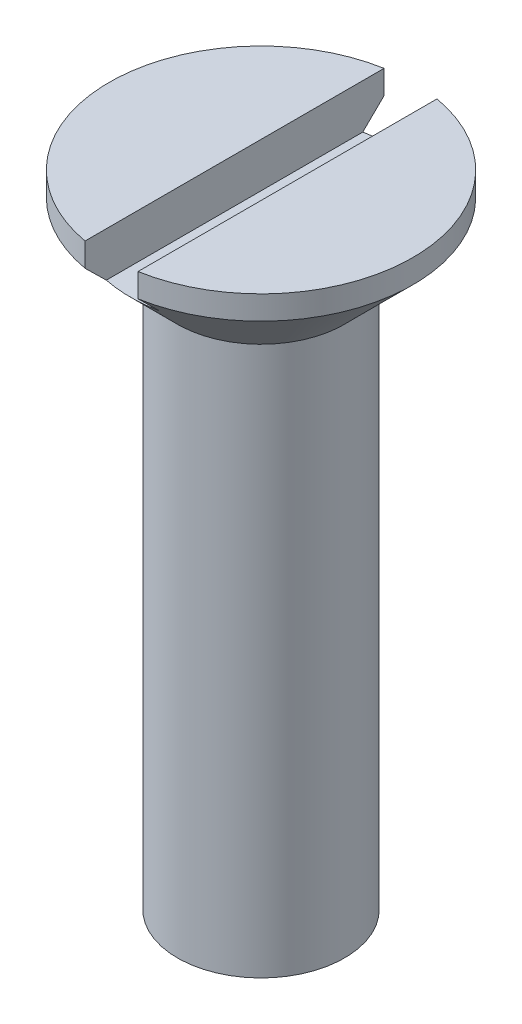
ISO-10303-21;
HEADER;
FILE_DESCRIPTION(('STEP AP214'),'2;1');
FILE_NAME('part.step','',(''),(''),'','','');
FILE_SCHEMA(('AUTOMOTIVE_DESIGN { 1 0 10303 214 1 1 1 1 }'));
ENDSEC;
DATA;
#1=APPLICATION_CONTEXT('core data for automotive mechanical design processes');
#2=APPLICATION_PROTOCOL_DEFINITION('international standard','automotive_design',2000,#1);
#3=PRODUCT_CONTEXT('',#1,'mechanical');
#4=PRODUCT('Part','Part','',(#3));
#5=PRODUCT_RELATED_PRODUCT_CATEGORY('part','',(#4));
#6=PRODUCT_DEFINITION_FORMATION('','',#4);
#7=PRODUCT_DEFINITION_CONTEXT('part definition',#1,'design');
#8=PRODUCT_DEFINITION('design','',#6,#7);
#9=PRODUCT_DEFINITION_SHAPE('','',#8);
#10=(LENGTH_UNIT() NAMED_UNIT(*) SI_UNIT(.MILLI.,.METRE.));
#11=(NAMED_UNIT(*) PLANE_ANGLE_UNIT() SI_UNIT($,.RADIAN.));
#12=(NAMED_UNIT(*) SI_UNIT($,.STERADIAN.) SOLID_ANGLE_UNIT());
#13=UNCERTAINTY_MEASURE_WITH_UNIT(LENGTH_MEASURE(1.E-05),#10,'distance_accuracy_value','');
#14=(GEOMETRIC_REPRESENTATION_CONTEXT(3) GLOBAL_UNCERTAINTY_ASSIGNED_CONTEXT((#13)) GLOBAL_UNIT_ASSIGNED_CONTEXT((#10,
#11,#12)) REPRESENTATION_CONTEXT('',''));
#15=CARTESIAN_POINT('',(0.,0.,0.));
#16=DIRECTION('',(0.,0.,1.));
#17=DIRECTION('',(1.,0.,0.));
#18=AXIS2_PLACEMENT_3D('',#15,#16,#17);
#19=CARTESIAN_POINT('',(0.,23.,0.));
#20=DIRECTION('',(0.,1.,0.));
#21=DIRECTION('',(-1.,0.,0.));
#22=AXIS2_PLACEMENT_3D('',#19,#20,#21);
#23=CYLINDRICAL_SURFACE('',#22,5.45);
#24=DIRECTION('',(0.,1.,0.));
#25=VECTOR('',#24,1.);
#26=CARTESIAN_POINT('',(-0.95,23.,5.36656314599949));
#27=LINE('',#26,#25);
#28=CARTESIAN_POINT('',(-0.95,23.,5.36656314599949));
#29=VERTEX_POINT('',#28);
#30=CARTESIAN_POINT('',(-0.95,22.15,5.36656314599949));
#31=VERTEX_POINT('',#30);
#32=EDGE_CURVE('E129',#29,#31,#27,.F.);
#33=ORIENTED_EDGE('',*,*,#32,.F.);
#34=CARTESIAN_POINT('',(0.,23.,0.));
#35=DIRECTION('',(0.,1.,0.));
#36=DIRECTION('',(-1.,0.,0.));
#37=AXIS2_PLACEMENT_3D('',#34,#35,#36);
#38=CIRCLE('',#37,5.45);
#39=CARTESIAN_POINT('',(-0.95,23.,-5.36656314599949));
#40=VERTEX_POINT('',#39);
#41=EDGE_CURVE('E120',#40,#29,#38,.T.);
#42=ORIENTED_EDGE('',*,*,#41,.F.);
#43=DIRECTION('',(0.,1.,0.));
#44=VECTOR('',#43,1.);
#45=CARTESIAN_POINT('',(-0.95,23.,-5.36656314599949));
#46=LINE('',#45,#44);
#47=CARTESIAN_POINT('',(-0.95,22.15,-5.36656314599949));
#48=VERTEX_POINT('',#47);
#49=EDGE_CURVE('E165',#48,#40,#46,.T.);
#50=ORIENTED_EDGE('',*,*,#49,.F.);
#51=CARTESIAN_POINT('',(0.,22.15,0.));
#52=DIRECTION('',(0.,1.,0.));
#53=DIRECTION('',(-1.,0.,0.));
#54=AXIS2_PLACEMENT_3D('',#51,#52,#53);
#55=CIRCLE('',#54,5.45);
#56=EDGE_CURVE('E119',#48,#31,#55,.T.);
#57=ORIENTED_EDGE('',*,*,#56,.T.);
#58=EDGE_LOOP('',(#33,#42,#50,#57));
#59=FACE_BOUND('',#58,.T.);
#60=ADVANCED_FACE('F45',(#59),#23,.T.);
#61=CARTESIAN_POINT('',(0.,23.,0.));
#62=DIRECTION('',(0.,1.,0.));
#63=DIRECTION('',(-1.,0.,0.));
#64=AXIS2_PLACEMENT_3D('',#61,#62,#63);
#65=PLANE('',#64);
#66=DIRECTION('',(0.,0.,1.));
#67=VECTOR('',#66,1.);
#68=CARTESIAN_POINT('',(-0.95,23.,0.));
#69=LINE('',#68,#67);
#70=EDGE_CURVE('E104',#40,#29,#69,.T.);
#71=ORIENTED_EDGE('',*,*,#70,.F.);
#72=ORIENTED_EDGE('',*,*,#41,.T.);
#73=EDGE_LOOP('',(#71,#72));
#74=FACE_BOUND('',#73,.T.);
#75=ADVANCED_FACE('F184',(#74),#65,.T.);
#76=CARTESIAN_POINT('',(0.,0.,0.));
#77=DIRECTION('',(0.,1.,0.));
#78=DIRECTION('',(-1.,0.,0.));
#79=AXIS2_PLACEMENT_3D('',#76,#77,#78);
#80=CONICAL_SURFACE('',#79,3.,1.04719755119659);
#81=CARTESIAN_POINT('',(0.,-1.7320508075689,0.));
#82=VERTEX_POINT('',#81);
#83=VERTEX_LOOP('',#82);
#84=FACE_BOUND('',#83,.T.);
#85=CARTESIAN_POINT('',(0.,0.,0.));
#86=DIRECTION('',(0.,1.,0.));
#87=DIRECTION('',(-1.,0.,0.));
#88=AXIS2_PLACEMENT_3D('',#85,#86,#87);
#89=CIRCLE('',#88,3.);
#90=CARTESIAN_POINT('',(-3.,0.,0.));
#91=VERTEX_POINT('',#90);
#92=EDGE_CURVE('E105',#91,#91,#89,.T.);
#93=ORIENTED_EDGE('',*,*,#92,.F.);
#94=EDGE_LOOP('',(#93));
#95=FACE_BOUND('',#94,.T.);
#96=ADVANCED_FACE('F47',(#84,#95),#80,.T.);
#97=CARTESIAN_POINT('',(0.,23.,0.));
#98=DIRECTION('',(0.,1.,0.));
#99=DIRECTION('',(-1.,0.,0.));
#100=AXIS2_PLACEMENT_3D('',#97,#98,#99);
#101=CYLINDRICAL_SURFACE('',#100,3.);
#102=ORIENTED_EDGE('',*,*,#92,.T.);
#103=EDGE_LOOP('',(#102));
#104=FACE_BOUND('',#103,.T.);
#105=CARTESIAN_POINT('',(0.,19.7,0.));
#106=DIRECTION('',(0.,1.,0.));
#107=DIRECTION('',(-1.,0.,0.));
#108=AXIS2_PLACEMENT_3D('',#105,#106,#107);
#109=CIRCLE('',#108,3.);
#110=CARTESIAN_POINT('',(-3.,19.7,0.));
#111=VERTEX_POINT('',#110);
#112=EDGE_CURVE('E132',#111,#111,#109,.T.);
#113=ORIENTED_EDGE('',*,*,#112,.F.);
#114=EDGE_LOOP('',(#113));
#115=FACE_BOUND('',#114,.T.);
#116=ADVANCED_FACE('F189',(#104,#115),#101,.T.);
#117=CARTESIAN_POINT('',(0.,22.15,0.));
#118=DIRECTION('',(0.,1.,0.));
#119=DIRECTION('',(-1.,0.,0.));
#120=AXIS2_PLACEMENT_3D('',#117,#118,#119);
#121=CONICAL_SURFACE('',#120,5.45,0.785398163397444);
#122=CARTESIAN_POINT('',(-0.95,22.1507,5.36727402784691));
#123=CARTESIAN_POINT('',(-0.95,22.0066414645828,5.22096942686692));
#124=CARTESIAN_POINT('',(-0.95,21.8626670090981,5.07458190529039));
#125=CARTESIAN_POINT('',(-0.95,21.5748101059668,4.78142879407387));
#126=CARTESIAN_POINT('',(-0.95,21.4309278942986,4.63466297275422));
#127=CARTESIAN_POINT('',(-0.95,21.1409084092543,4.33821736729775));
#128=CARTESIAN_POINT('',(-0.95,20.9947766015238,4.18853223049866));
#129=CARTESIAN_POINT('',(-0.95,20.703095971748,3.8888862480953));
#130=CARTESIAN_POINT('',(-0.95,20.5575467133769,3.73892582684178));
#131=CARTESIAN_POINT('',(-0.95,20.1841431553791,3.35268732026557));
#132=CARTESIAN_POINT('',(-0.95,19.9567216786612,3.11598875256886));
#133=CARTESIAN_POINT('',(-0.95,19.6172653560709,2.75849636400411));
#134=CARTESIAN_POINT('',(-0.950000000000001,19.5041829404961,2.63869876965934));
#135=CARTESIAN_POINT('',(-0.950000000000001,19.279122950606,2.3981635782147));
#136=CARTESIAN_POINT('',(-0.950000000000001,19.1671449310138,2.27742639827611));
#137=CARTESIAN_POINT('',(-0.950000000000001,18.9464813770811,2.03630430512404));
#138=CARTESIAN_POINT('',(-0.95,18.8377716601377,1.9159416674153));
#139=CARTESIAN_POINT('',(-0.950000000000001,18.6765899716622,1.73355249406455));
#140=CARTESIAN_POINT('',(-0.950000000000001,18.6231332919473,1.67239741852466));
#141=CARTESIAN_POINT('',(-0.950000000000001,18.5171142480341,1.54931822073711));
#142=CARTESIAN_POINT('',(-0.950000000000001,18.4645518520347,1.48739412597211));
#143=CARTESIAN_POINT('',(-0.950000000000001,18.3610106756752,1.36295298776711));
#144=CARTESIAN_POINT('',(-0.950000000000001,18.3100234789139,1.30044297031367));
#145=CARTESIAN_POINT('',(-0.950000000000001,18.2097768557509,1.17405781364908));
#146=CARTESIAN_POINT('',(-0.950000000000001,18.1605171425635,1.11018290388926));
#147=CARTESIAN_POINT('',(-0.950000000000001,18.0646842233115,0.980693167144416));
#148=CARTESIAN_POINT('',(-0.950000000000001,18.018104441057,0.915083231273146));
#149=CARTESIAN_POINT('',(-0.950000000000001,17.9289406266786,0.781218199399258));
#150=CARTESIAN_POINT('',(-0.950000000000001,17.8863524092791,0.712965982498646));
#151=CARTESIAN_POINT('',(-0.950000000000001,17.8383458219484,0.627290830226431));
#152=CARTESIAN_POINT('',(-0.950000000000001,17.8297832206589,0.611626968875242));
#153=CARTESIAN_POINT('',(-0.950000000000001,17.813029231131,0.58009770462537));
#154=CARTESIAN_POINT('',(-0.950000000000001,17.804837925926,0.564232257651593));
#155=CARTESIAN_POINT('',(-0.950000000000001,17.7808895294853,0.516321345769392));
#156=CARTESIAN_POINT('',(-0.950000000000001,17.7657564437722,0.483958640203385));
#157=CARTESIAN_POINT('',(-0.950000000000001,17.7377461184084,0.418661506764504));
#158=CARTESIAN_POINT('',(-0.950000000000001,17.724847057251,0.385736523552167));
#159=CARTESIAN_POINT('',(-0.950000000000001,17.7016315116072,0.31897291698118));
#160=CARTESIAN_POINT('',(-0.950000000000001,17.6913148961361,0.285134340057601));
#161=CARTESIAN_POINT('',(-0.950000000000001,17.6755998536932,0.223588326667057));
#162=CARTESIAN_POINT('',(-0.950000000000001,17.6696284392153,0.196027953954517));
#163=CARTESIAN_POINT('',(-0.950000000000001,17.6599469693575,0.140515145544489));
#164=CARTESIAN_POINT('',(-0.950000000000001,17.6562362385423,0.112562829505701));
#165=CARTESIAN_POINT('',(-0.950000000000001,17.6512689884953,0.0564821272998736));
#166=CARTESIAN_POINT('',(-0.950000000000001,17.650008484062,0.0283541018134334));
#167=CARTESIAN_POINT('',(-0.950000000000001,17.6499915683311,-0.0279054650456573));
#168=CARTESIAN_POINT('',(-0.950000000000001,17.6512359798955,-0.0560370045371329));
#169=CARTESIAN_POINT('',(-0.950000000000001,17.6586455392972,-0.139905474855347));
#170=CARTESIAN_POINT('',(-0.950000000000001,17.6684666216025,-0.195353553361766));
#171=CARTESIAN_POINT('',(-0.950000000000001,17.689188398885,-0.276951858970864));
#172=CARTESIAN_POINT('',(-0.950000000000001,17.6971136013113,-0.303935870798544));
#173=CARTESIAN_POINT('',(-0.950000000000001,17.7146748611862,-0.357345323945096));
#174=CARTESIAN_POINT('',(-0.950000000000001,17.7243108584581,-0.383770784874286));
#175=CARTESIAN_POINT('',(-0.950000000000001,17.7636503552317,-0.483109331771264));
#176=CARTESIAN_POINT('',(-0.950000000000001,17.7982520801576,-0.554072842248656));
#177=CARTESIAN_POINT('',(-0.950000000000001,17.8741117655428,-0.692377095293876));
#178=CARTESIAN_POINT('',(-0.950000000000001,17.9153868206254,-0.759707925194222));
#179=CARTESIAN_POINT('',(-0.950000000000001,18.0023346103427,-0.892236746835653));
#180=CARTESIAN_POINT('',(-0.950000000000001,18.0480407691997,-0.95741260126683));
#181=CARTESIAN_POINT('',(-0.950000000000001,18.1185374399944,-1.05366873930196));
#182=CARTESIAN_POINT('',(-0.950000000000001,18.1423441800046,-1.08548396626286));
#183=CARTESIAN_POINT('',(-0.950000000000001,18.1905006808391,-1.14870022001977));
#184=CARTESIAN_POINT('',(-0.950000000000001,18.2148504230797,-1.18010126093263));
#185=CARTESIAN_POINT('',(-0.950000000000001,18.2953230201044,-1.28237587769292));
#186=CARTESIAN_POINT('',(-0.950000000000001,18.3523675591555,-1.3525232741423));
#187=CARTESIAN_POINT('',(-0.950000000000001,18.4679801194338,-1.49155447486919));
#188=CARTESIAN_POINT('',(-0.950000000000001,18.5265483162725,-1.56043813191836));
#189=CARTESIAN_POINT('',(-0.950000000000001,18.6447743313509,-1.69730257484199));
#190=CARTESIAN_POINT('',(-0.950000000000001,18.7044325111515,-1.76528304771263));
#191=CARTESIAN_POINT('',(-0.950000000000001,18.8245307259535,-1.9005507473884));
#192=CARTESIAN_POINT('',(-0.950000000000001,18.8849707792632,-1.96783795789368));
#193=CARTESIAN_POINT('',(-0.950000000000001,19.0673240017472,-2.16909659121555));
#194=CARTESIAN_POINT('',(-0.950000000000001,19.1901072719948,-2.30227879707878));
#195=CARTESIAN_POINT('',(-0.950000000000001,19.4370326196775,-2.56731989942243));
#196=CARTESIAN_POINT('',(-0.95,19.5611744145449,-2.69917906055066));
#197=CARTESIAN_POINT('',(-0.95,19.809781027783,-2.96141357028916));
#198=CARTESIAN_POINT('',(-0.95,19.9342415618214,-3.09179298391836));
#199=CARTESIAN_POINT('',(-0.95,20.1837912251015,-3.35196093172164));
#200=CARTESIAN_POINT('',(-0.95,20.3088803866407,-3.48174943486936));
#201=CARTESIAN_POINT('',(-0.95,20.6846560866124,-3.87032055879081));
#202=CARTESIAN_POINT('',(-0.95,20.9360010528692,-4.12846624524092));
#203=CARTESIAN_POINT('',(-0.95,21.267844479713,-4.46799564927132));
#204=CARTESIAN_POINT('',(-0.95,21.3479036444104,-4.54981026078771));
#205=CARTESIAN_POINT('',(-0.95,21.508119094744,-4.71336230831205));
#206=CARTESIAN_POINT('',(-0.95,21.5882753902212,-4.79509973468872));
#207=CARTESIAN_POINT('',(-0.95,21.7487769343448,-4.95861796157243));
#208=CARTESIAN_POINT('',(-0.95,21.8291222894124,-5.04039865757633));
#209=CARTESIAN_POINT('',(-0.95,21.9898691554973,-5.20388671182276));
#210=CARTESIAN_POINT('',(-0.95,22.0702706591624,-5.28559407729382));
#211=CARTESIAN_POINT('',(-0.95,22.1507,-5.36727402784691));
#212=B_SPLINE_CURVE_WITH_KNOTS('',3,(#122,#123,#124,#125,#126,#127,#128,#129,#130,#131,#132,
#133,#134,#135,#136,#137,#138,#139,#140,#141,#142,#143,#144,#145,#146,#147,#148,#149,#150,#151,
#152,#153,#154,#155,#156,#157,#158,#159,#160,#161,#162,#163,#164,#165,#166,#167,#168,#169,#170,
#171,#172,#173,#174,#175,#176,#177,#178,#179,#180,#181,#182,#183,#184,#185,#186,#187,#188,#189,
#190,#191,#192,#193,#194,#195,#196,#197,#198,#199,#200,#201,#202,#203,#204,#205,#206,#207,#208,
#209,#210,#211),.UNSPECIFIED.,.F.,.F.,(4,2,2,2,2,2,2,2,2,2,2,2,2,2,2,2,2,2,2,2,2,2,2,2,2,2,2,2,
2,2,2,2,2,2,2,2,2,2,2,2,2,2,2,2,4),(0.,0.615971733476585,1.23255943239412,1.86012628446737,
2.48706670861855,3.47179557281985,3.96600953924986,4.46001535278199,4.94655187034503,
5.19022198069897,5.43388340786631,5.67586585560889,5.91780793896075,6.15912850734742,
6.4001931448015,6.45374310913536,6.50730499041661,6.61441955613181,6.72042026818555,
6.82641560266439,6.91093252340633,6.99542418022094,7.07977829915207,7.16416013283658,
7.33221931503604,7.4165513342557,7.50088038770463,7.73701700389003,7.97376838906795,
8.21246995736466,8.33167593620553,8.45087784155276,8.72208373607498,8.99332102854834,
9.26464998888793,9.53598531416906,10.079398208818,10.622700146502,11.1634398873134,
11.7042077001593,12.7850905081256,13.1284969121905,13.4719416386942,13.8158763771414,
14.1597723411595),.UNSPECIFIED.);
#213=CARTESIAN_POINT('',(-0.95,21.4,4.60298815988047));
#214=VERTEX_POINT('',#213);
#215=EDGE_CURVE('E127',#31,#214,#212,.T.);
#216=ORIENTED_EDGE('',*,*,#215,.F.);
#217=ORIENTED_EDGE('',*,*,#56,.F.);
#218=CARTESIAN_POINT('',(-0.95,21.4,-4.60298815988048));
#219=VERTEX_POINT('',#218);
#220=EDGE_CURVE('E156',#219,#48,#212,.T.);
#221=ORIENTED_EDGE('',*,*,#220,.F.);
#222=CARTESIAN_POINT('',(0.,21.4,0.));
#223=DIRECTION('',(0.,-1.,0.));
#224=DIRECTION('',(0.,0.,-1.));
#225=AXIS2_PLACEMENT_3D('',#222,#223,#224);
#226=CIRCLE('',#225,4.69999999999998);
#227=CARTESIAN_POINT('',(0.95,21.4,-4.60298815988048));
#228=VERTEX_POINT('',#227);
#229=EDGE_CURVE('E49',#228,#219,#226,.F.);
#230=ORIENTED_EDGE('',*,*,#229,.F.);
#231=CARTESIAN_POINT('',(0.95,22.1507,-5.36727402784691));
#232=CARTESIAN_POINT('',(0.95,22.0066414645828,-5.22096942686692));
#233=CARTESIAN_POINT('',(0.95,21.8626670090981,-5.07458190529039));
#234=CARTESIAN_POINT('',(0.95,21.5748101059668,-4.78142879407387));
#235=CARTESIAN_POINT('',(0.95,21.4309278942986,-4.63466297275422));
#236=CARTESIAN_POINT('',(0.95,21.1409084092543,-4.33821736729775));
#237=CARTESIAN_POINT('',(0.95,20.9947766015238,-4.18853223049866));
#238=CARTESIAN_POINT('',(0.95,20.703095971748,-3.8888862480953));
#239=CARTESIAN_POINT('',(0.95,20.5575467133769,-3.73892582684178));
#240=CARTESIAN_POINT('',(0.95,20.1841431553791,-3.35268732026557));
#241=CARTESIAN_POINT('',(0.95,19.9567216786612,-3.11598875256885));
#242=CARTESIAN_POINT('',(0.95,19.6172653560709,-2.75849636400411));
#243=CARTESIAN_POINT('',(0.950000000000001,19.5041829404961,-2.63869876965933));
#244=CARTESIAN_POINT('',(0.950000000000001,19.279122950606,-2.39816357821469));
#245=CARTESIAN_POINT('',(0.950000000000001,19.1671449310138,-2.2774263982761));
#246=CARTESIAN_POINT('',(0.950000000000001,18.9464813770811,-2.03630430512404));
#247=CARTESIAN_POINT('',(0.95,18.8377716601377,-1.9159416674153));
#248=CARTESIAN_POINT('',(0.950000000000001,18.6765899716622,-1.73355249406455));
#249=CARTESIAN_POINT('',(0.950000000000001,18.6231332919473,-1.67239741852466));
#250=CARTESIAN_POINT('',(0.950000000000001,18.5171142480341,-1.54931822073711));
#251=CARTESIAN_POINT('',(0.950000000000001,18.4645518520347,-1.48739412597211));
#252=CARTESIAN_POINT('',(0.950000000000001,18.3610106756752,-1.36295298776711));
#253=CARTESIAN_POINT('',(0.950000000000001,18.3100234789139,-1.30044297031366));
#254=CARTESIAN_POINT('',(0.950000000000001,18.2097768557509,-1.17405781364908));
#255=CARTESIAN_POINT('',(0.950000000000001,18.1605171425635,-1.11018290388926));
#256=CARTESIAN_POINT('',(0.950000000000001,18.0646842233115,-0.980693167144415));
#257=CARTESIAN_POINT('',(0.950000000000001,18.018104441057,-0.915083231273144));
#258=CARTESIAN_POINT('',(0.950000000000001,17.9289406266786,-0.781218199399255));
#259=CARTESIAN_POINT('',(0.950000000000001,17.8863524092791,-0.712965982498644));
#260=CARTESIAN_POINT('',(0.950000000000001,17.8383458219484,-0.62729083022643));
#261=CARTESIAN_POINT('',(0.950000000000001,17.8297832206589,-0.611626968875241));
#262=CARTESIAN_POINT('',(0.950000000000001,17.813029231131,-0.58009770462537));
#263=CARTESIAN_POINT('',(0.950000000000001,17.804837925926,-0.564232257651595));
#264=CARTESIAN_POINT('',(0.950000000000001,17.7808895294853,-0.516321345769393));
#265=CARTESIAN_POINT('',(0.950000000000001,17.7657564437722,-0.483958640203385));
#266=CARTESIAN_POINT('',(0.950000000000001,17.7377461184084,-0.418661506764503));
#267=CARTESIAN_POINT('',(0.950000000000001,17.724847057251,-0.385736523552166));
#268=CARTESIAN_POINT('',(0.950000000000001,17.7016315116072,-0.318972916981179));
#269=CARTESIAN_POINT('',(0.950000000000001,17.6913148961361,-0.285134340057601));
#270=CARTESIAN_POINT('',(0.950000000000001,17.6755998536932,-0.223588326667056));
#271=CARTESIAN_POINT('',(0.950000000000001,17.6696284392153,-0.196027953954516));
#272=CARTESIAN_POINT('',(0.950000000000001,17.6599469693575,-0.140515145544488));
#273=CARTESIAN_POINT('',(0.950000000000001,17.6562362385423,-0.1125628295057));
#274=CARTESIAN_POINT('',(0.950000000000001,17.6512689884953,-0.0564821272998725));
#275=CARTESIAN_POINT('',(0.950000000000001,17.650008484062,-0.028354101813432));
#276=CARTESIAN_POINT('',(0.950000000000001,17.6499915683311,0.0279054650456587));
#277=CARTESIAN_POINT('',(0.950000000000001,17.6512359798955,0.056037004537134));
#278=CARTESIAN_POINT('',(0.950000000000001,17.6586455392972,0.139905474855348));
#279=CARTESIAN_POINT('',(0.950000000000001,17.6684666216025,0.195353553361767));
#280=CARTESIAN_POINT('',(0.950000000000001,17.689188398885,0.276951858970865));
#281=CARTESIAN_POINT('',(0.950000000000001,17.6971136013113,0.303935870798545));
#282=CARTESIAN_POINT('',(0.950000000000001,17.7146748611862,0.357345323945097));
#283=CARTESIAN_POINT('',(0.950000000000001,17.7243108584581,0.383770784874286));
#284=CARTESIAN_POINT('',(0.950000000000001,17.7636503552317,0.483109331771265));
#285=CARTESIAN_POINT('',(0.950000000000001,17.7982520801576,0.554072842248656));
#286=CARTESIAN_POINT('',(0.950000000000001,17.8741117655428,0.692377095293876));
#287=CARTESIAN_POINT('',(0.950000000000001,17.9153868206254,0.759707925194222));
#288=CARTESIAN_POINT('',(0.950000000000001,18.0023346103427,0.892236746835653));
#289=CARTESIAN_POINT('',(0.950000000000001,18.0480407691997,0.957412601266829));
#290=CARTESIAN_POINT('',(0.950000000000001,18.1185374399944,1.05366873930196));
#291=CARTESIAN_POINT('',(0.950000000000001,18.1423441800046,1.08548396626286));
#292=CARTESIAN_POINT('',(0.950000000000001,18.1905006808391,1.14870022001977));
#293=CARTESIAN_POINT('',(0.950000000000001,18.2148504230797,1.18010126093263));
#294=CARTESIAN_POINT('',(0.950000000000001,18.2953230201044,1.28237587769293));
#295=CARTESIAN_POINT('',(0.950000000000001,18.3523675591555,1.35252327414231));
#296=CARTESIAN_POINT('',(0.950000000000001,18.4679801194338,1.49155447486919));
#297=CARTESIAN_POINT('',(0.950000000000001,18.5265483162725,1.56043813191836));
#298=CARTESIAN_POINT('',(0.950000000000001,18.6447743313509,1.69730257484199));
#299=CARTESIAN_POINT('',(0.950000000000001,18.7044325111515,1.76528304771263));
#300=CARTESIAN_POINT('',(0.950000000000001,18.8245307259535,1.9005507473884));
#301=CARTESIAN_POINT('',(0.950000000000001,18.8849707792632,1.96783795789368));
#302=CARTESIAN_POINT('',(0.950000000000001,19.0673240017472,2.16909659121555));
#303=CARTESIAN_POINT('',(0.950000000000001,19.1901072719948,2.30227879707879));
#304=CARTESIAN_POINT('',(0.950000000000001,19.4370326196775,2.56731989942243));
#305=CARTESIAN_POINT('',(0.95,19.5611744145449,2.69917906055067));
#306=CARTESIAN_POINT('',(0.95,19.809781027783,2.96141357028917));
#307=CARTESIAN_POINT('',(0.95,19.9342415618214,3.09179298391836));
#308=CARTESIAN_POINT('',(0.95,20.1837912251015,3.35196093172165));
#309=CARTESIAN_POINT('',(0.95,20.3088803866407,3.48174943486937));
#310=CARTESIAN_POINT('',(0.95,20.6846560866124,3.87032055879082));
#311=CARTESIAN_POINT('',(0.95,20.9360010528692,4.12846624524093));
#312=CARTESIAN_POINT('',(0.95,21.267844479713,4.46799564927133));
#313=CARTESIAN_POINT('',(0.95,21.3479036444105,4.54981026078773));
#314=CARTESIAN_POINT('',(0.95,21.508119094744,4.71336230831206));
#315=CARTESIAN_POINT('',(0.95,21.5882753902212,4.79509973468873));
#316=CARTESIAN_POINT('',(0.95,21.7487769343448,4.95861796157243));
#317=CARTESIAN_POINT('',(0.95,21.8291222894124,5.04039865757633));
#318=CARTESIAN_POINT('',(0.95,21.9898691554973,5.20388671182277));
#319=CARTESIAN_POINT('',(0.95,22.0702706591624,5.28559407729382));
#320=CARTESIAN_POINT('',(0.95,22.1507,5.36727402784691));
#321=B_SPLINE_CURVE_WITH_KNOTS('',3,(#231,#232,#233,#234,#235,#236,#237,#238,#239,#240,#241,
#242,#243,#244,#245,#246,#247,#248,#249,#250,#251,#252,#253,#254,#255,#256,#257,#258,#259,#260,
#261,#262,#263,#264,#265,#266,#267,#268,#269,#270,#271,#272,#273,#274,#275,#276,#277,#278,#279,
#280,#281,#282,#283,#284,#285,#286,#287,#288,#289,#290,#291,#292,#293,#294,#295,#296,#297,#298,
#299,#300,#301,#302,#303,#304,#305,#306,#307,#308,#309,#310,#311,#312,#313,#314,#315,#316,#317,
#318,#319,#320),.UNSPECIFIED.,.F.,.F.,(4,2,2,2,2,2,2,2,2,2,2,2,2,2,2,2,2,2,2,2,2,2,2,2,2,2,2,2,
2,2,2,2,2,2,2,2,2,2,2,2,2,2,2,2,4),(0.,0.615971733476585,1.23255943239412,1.86012628446737,
2.48706670861855,3.47179557281985,3.96600953924986,4.460015352782,4.94655187034503,
5.19022198069896,5.43388340786631,5.67586585560889,5.91780793896075,6.15912850734742,
6.4001931448015,6.45374310913536,6.50730499041661,6.61441955613181,6.72042026818555,
6.82641560266439,6.91093252340633,6.99542418022094,7.07977829915207,7.16416013283658,
7.33221931503604,7.4165513342557,7.50088038770463,7.73701700389003,7.97376838906795,
8.21246995736466,8.33167593620552,8.45087784155276,8.72208373607498,8.99332102854834,
9.26464998888793,9.53598531416906,10.079398208818,10.6227001465021,11.1634398873134,
11.7042077001593,12.7850905081256,13.1284969121905,13.4719416386942,13.8158763771414,
14.1597723411595),.UNSPECIFIED.);
#322=CARTESIAN_POINT('',(0.95,22.15,-5.36656314599949));
#323=VERTEX_POINT('',#322);
#324=EDGE_CURVE('E114',#323,#228,#321,.T.);
#325=ORIENTED_EDGE('',*,*,#324,.F.);
#326=CARTESIAN_POINT('',(0.95,22.15,5.36656314599949));
#327=VERTEX_POINT('',#326);
#328=EDGE_CURVE('E112',#327,#323,#55,.T.);
#329=ORIENTED_EDGE('',*,*,#328,.F.);
#330=CARTESIAN_POINT('',(0.95,21.4,4.60298815988047));
#331=VERTEX_POINT('',#330);
#332=EDGE_CURVE('E115',#331,#327,#321,.T.);
#333=ORIENTED_EDGE('',*,*,#332,.F.);
#334=EDGE_CURVE('E11',#214,#331,#226,.F.);
#335=ORIENTED_EDGE('',*,*,#334,.F.);
#336=EDGE_LOOP('',(#216,#217,#221,#230,#325,#329,#333,#335));
#337=FACE_BOUND('',#336,.T.);
#338=ORIENTED_EDGE('',*,*,#112,.T.);
#339=EDGE_LOOP('',(#338));
#340=FACE_BOUND('',#339,.T.);
#341=ADVANCED_FACE('F162',(#337,#340),#121,.T.);
#342=DIRECTION('',(0.,1.,0.));
#343=VECTOR('',#342,1.);
#344=CARTESIAN_POINT('',(0.95,23.,-5.36656314599949));
#345=LINE('',#344,#343);
#346=CARTESIAN_POINT('',(0.95,23.,-5.36656314599949));
#347=VERTEX_POINT('',#346);
#348=EDGE_CURVE('E98',#347,#323,#345,.F.);
#349=ORIENTED_EDGE('',*,*,#348,.F.);
#350=CARTESIAN_POINT('',(0.95,23.,5.36656314599949));
#351=VERTEX_POINT('',#350);
#352=EDGE_CURVE('E110',#351,#347,#38,.T.);
#353=ORIENTED_EDGE('',*,*,#352,.F.);
#354=DIRECTION('',(0.,1.,0.));
#355=VECTOR('',#354,1.);
#356=CARTESIAN_POINT('',(0.95,23.,5.36656314599949));
#357=LINE('',#356,#355);
#358=EDGE_CURVE('E61',#327,#351,#357,.T.);
#359=ORIENTED_EDGE('',*,*,#358,.F.);
#360=ORIENTED_EDGE('',*,*,#328,.T.);
#361=EDGE_LOOP('',(#349,#353,#359,#360));
#362=FACE_BOUND('',#361,.T.);
#363=ADVANCED_FACE('F109',(#362),#23,.T.);
#364=DIRECTION('',(0.,0.,-1.));
#365=VECTOR('',#364,1.);
#366=CARTESIAN_POINT('',(0.95,23.,0.));
#367=LINE('',#366,#365);
#368=EDGE_CURVE('E95',#351,#347,#367,.T.);
#369=ORIENTED_EDGE('',*,*,#368,.F.);
#370=ORIENTED_EDGE('',*,*,#352,.T.);
#371=EDGE_LOOP('',(#369,#370));
#372=FACE_BOUND('',#371,.T.);
#373=ADVANCED_FACE('F117',(#372),#65,.T.);
#374=CARTESIAN_POINT('',(-0.95,23.,-5.45));
#375=DIRECTION('',(-1.,0.,0.));
#376=DIRECTION('',(0.,-1.,0.));
#377=AXIS2_PLACEMENT_3D('',#374,#375,#376);
#378=PLANE('',#377);
#379=ORIENTED_EDGE('',*,*,#215,.T.);
#380=DIRECTION('',(0.,0.,1.));
#381=VECTOR('',#380,1.);
#382=CARTESIAN_POINT('',(-0.95,21.4,-5.45));
#383=LINE('',#382,#381);
#384=EDGE_CURVE('E149',#219,#214,#383,.T.);
#385=ORIENTED_EDGE('',*,*,#384,.F.);
#386=ORIENTED_EDGE('',*,*,#220,.T.);
#387=ORIENTED_EDGE('',*,*,#49,.T.);
#388=ORIENTED_EDGE('',*,*,#70,.T.);
#389=ORIENTED_EDGE('',*,*,#32,.T.);
#390=EDGE_LOOP('',(#379,#385,#386,#387,#388,#389));
#391=FACE_BOUND('',#390,.T.);
#392=ADVANCED_FACE('F155',(#391),#378,.F.);
#393=CARTESIAN_POINT('',(0.95,23.,-5.45));
#394=DIRECTION('',(1.,0.,0.));
#395=DIRECTION('',(0.,1.,0.));
#396=AXIS2_PLACEMENT_3D('',#393,#394,#395);
#397=PLANE('',#396);
#398=ORIENTED_EDGE('',*,*,#324,.T.);
#399=DIRECTION('',(0.,0.,1.));
#400=VECTOR('',#399,1.);
#401=CARTESIAN_POINT('',(0.95,21.4,-5.45));
#402=LINE('',#401,#400);
#403=EDGE_CURVE('E152',#228,#331,#402,.T.);
#404=ORIENTED_EDGE('',*,*,#403,.T.);
#405=ORIENTED_EDGE('',*,*,#332,.T.);
#406=ORIENTED_EDGE('',*,*,#358,.T.);
#407=ORIENTED_EDGE('',*,*,#368,.T.);
#408=ORIENTED_EDGE('',*,*,#348,.T.);
#409=EDGE_LOOP('',(#398,#404,#405,#406,#407,#408));
#410=FACE_BOUND('',#409,.T.);
#411=ADVANCED_FACE('F97',(#410),#397,.F.);
#412=CARTESIAN_POINT('',(-0.95,21.4,-5.45));
#413=DIRECTION('',(0.,-1.,0.));
#414=DIRECTION('',(0.,0.,-1.));
#415=AXIS2_PLACEMENT_3D('',#412,#413,#414);
#416=PLANE('',#415);
#417=ORIENTED_EDGE('',*,*,#334,.T.);
#418=ORIENTED_EDGE('',*,*,#403,.F.);
#419=ORIENTED_EDGE('',*,*,#229,.T.);
#420=ORIENTED_EDGE('',*,*,#384,.T.);
#421=EDGE_LOOP('',(#417,#418,#419,#420));
#422=FACE_BOUND('',#421,.T.);
#423=ADVANCED_FACE('F148',(#422),#416,.F.);
#424=CLOSED_SHELL('',(#60,#75,#96,#116,#341,#363,#373,#392,#411,#423));
#425=MANIFOLD_SOLID_BREP('B2',#424);
#426=ADVANCED_BREP_SHAPE_REPRESENTATION('',(#18,#425),#14);
#427=SHAPE_DEFINITION_REPRESENTATION(#9,#426);
ENDSEC;
END-ISO-10303-21;
